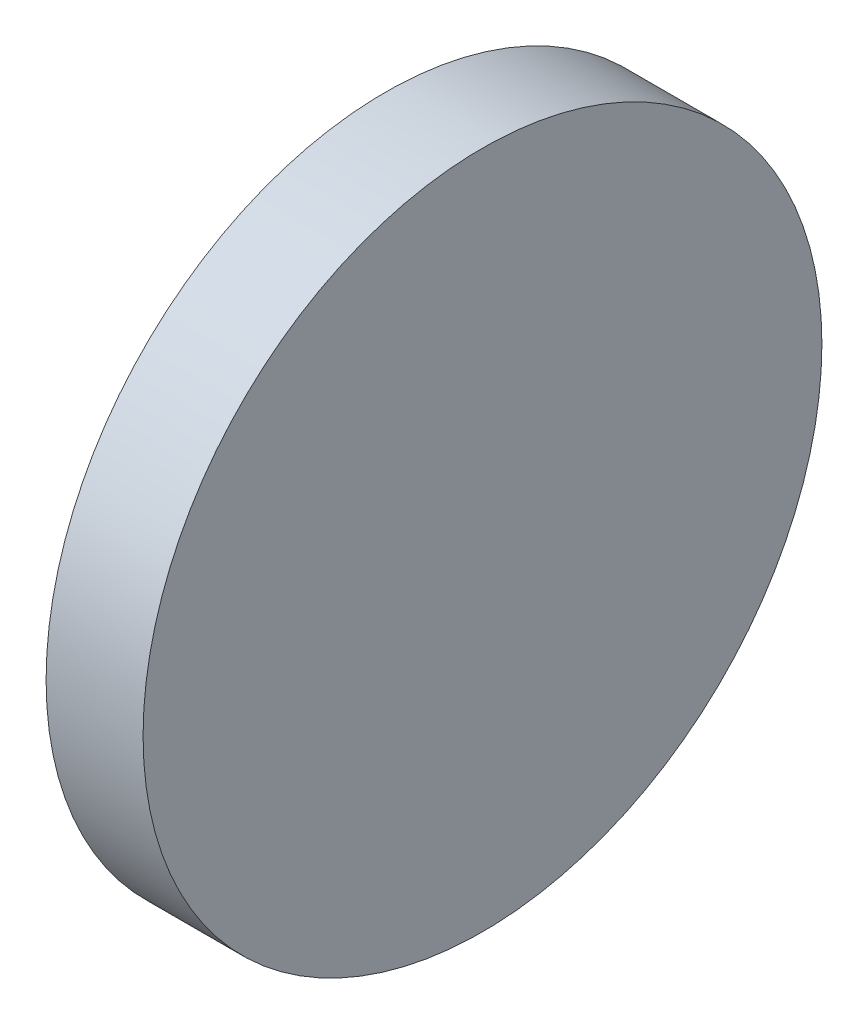
ISO-10303-21;
HEADER;
FILE_DESCRIPTION(('STEP AP214'),'2;1');
FILE_NAME('part.step','',(''),(''),'','','');
FILE_SCHEMA(('AUTOMOTIVE_DESIGN { 1 0 10303 214 1 1 1 1 }'));
ENDSEC;
DATA;
#1=APPLICATION_CONTEXT('core data for automotive mechanical design processes');
#2=APPLICATION_PROTOCOL_DEFINITION('international standard','automotive_design',2000,#1);
#3=PRODUCT_CONTEXT('',#1,'mechanical');
#4=PRODUCT('Part','Part','',(#3));
#5=PRODUCT_RELATED_PRODUCT_CATEGORY('part','',(#4));
#6=PRODUCT_DEFINITION_FORMATION('','',#4);
#7=PRODUCT_DEFINITION_CONTEXT('part definition',#1,'design');
#8=PRODUCT_DEFINITION('design','',#6,#7);
#9=PRODUCT_DEFINITION_SHAPE('','',#8);
#10=(LENGTH_UNIT() NAMED_UNIT(*) SI_UNIT(.MILLI.,.METRE.));
#11=(NAMED_UNIT(*) PLANE_ANGLE_UNIT() SI_UNIT($,.RADIAN.));
#12=(NAMED_UNIT(*) SI_UNIT($,.STERADIAN.) SOLID_ANGLE_UNIT());
#13=UNCERTAINTY_MEASURE_WITH_UNIT(LENGTH_MEASURE(1.E-05),#10,'distance_accuracy_value','');
#14=(GEOMETRIC_REPRESENTATION_CONTEXT(3) GLOBAL_UNCERTAINTY_ASSIGNED_CONTEXT((#13)) GLOBAL_UNIT_ASSIGNED_CONTEXT((#10,
#11,#12)) REPRESENTATION_CONTEXT('',''));
#15=CARTESIAN_POINT('',(0.,0.,0.));
#16=DIRECTION('',(0.,0.,1.));
#17=DIRECTION('',(1.,0.,0.));
#18=AXIS2_PLACEMENT_3D('',#15,#16,#17);
#19=CARTESIAN_POINT('',(-10.,0.,0.));
#20=DIRECTION('',(1.,0.,0.));
#21=DIRECTION('',(0.,0.,-1.));
#22=AXIS2_PLACEMENT_3D('',#19,#20,#21);
#23=CYLINDRICAL_SURFACE('',#22,35.);
#24=CARTESIAN_POINT('',(-10.,0.,0.));
#25=DIRECTION('',(1.,0.,0.));
#26=DIRECTION('',(0.,0.,-1.));
#27=AXIS2_PLACEMENT_3D('',#24,#25,#26);
#28=CIRCLE('',#27,35.);
#29=CARTESIAN_POINT('',(-10.,0.,-35.));
#30=VERTEX_POINT('',#29);
#31=EDGE_CURVE('E10',#30,#30,#28,.T.);
#32=ORIENTED_EDGE('',*,*,#31,.T.);
#33=EDGE_LOOP('',(#32));
#34=FACE_BOUND('',#33,.T.);
#35=CARTESIAN_POINT('',(0.,0.,0.));
#36=DIRECTION('',(1.,0.,0.));
#37=DIRECTION('',(0.,0.,-1.));
#38=AXIS2_PLACEMENT_3D('',#35,#36,#37);
#39=CIRCLE('',#38,35.);
#40=CARTESIAN_POINT('',(0.,0.,-35.));
#41=VERTEX_POINT('',#40);
#42=EDGE_CURVE('E34',#41,#41,#39,.T.);
#43=ORIENTED_EDGE('',*,*,#42,.F.);
#44=EDGE_LOOP('',(#43));
#45=FACE_BOUND('',#44,.T.);
#46=ADVANCED_FACE('F31',(#34,#45),#23,.T.);
#47=CARTESIAN_POINT('',(-10.,0.,0.));
#48=DIRECTION('',(1.,0.,0.));
#49=DIRECTION('',(0.,0.,-1.));
#50=AXIS2_PLACEMENT_3D('',#47,#48,#49);
#51=PLANE('',#50);
#52=ORIENTED_EDGE('',*,*,#31,.F.);
#53=EDGE_LOOP('',(#52));
#54=FACE_BOUND('',#53,.T.);
#55=ADVANCED_FACE('F46',(#54),#51,.F.);
#56=CARTESIAN_POINT('',(0.,0.,0.));
#57=DIRECTION('',(1.,0.,0.));
#58=DIRECTION('',(0.,0.,-1.));
#59=AXIS2_PLACEMENT_3D('',#56,#57,#58);
#60=PLANE('',#59);
#61=ORIENTED_EDGE('',*,*,#42,.T.);
#62=EDGE_LOOP('',(#61));
#63=FACE_BOUND('',#62,.T.);
#64=ADVANCED_FACE('F43',(#63),#60,.T.);
#65=CLOSED_SHELL('',(#46,#55,#64));
#66=MANIFOLD_SOLID_BREP('B2',#65);
#67=ADVANCED_BREP_SHAPE_REPRESENTATION('',(#18,#66),#14);
#68=SHAPE_DEFINITION_REPRESENTATION(#9,#67);
ENDSEC;
END-ISO-10303-21;
